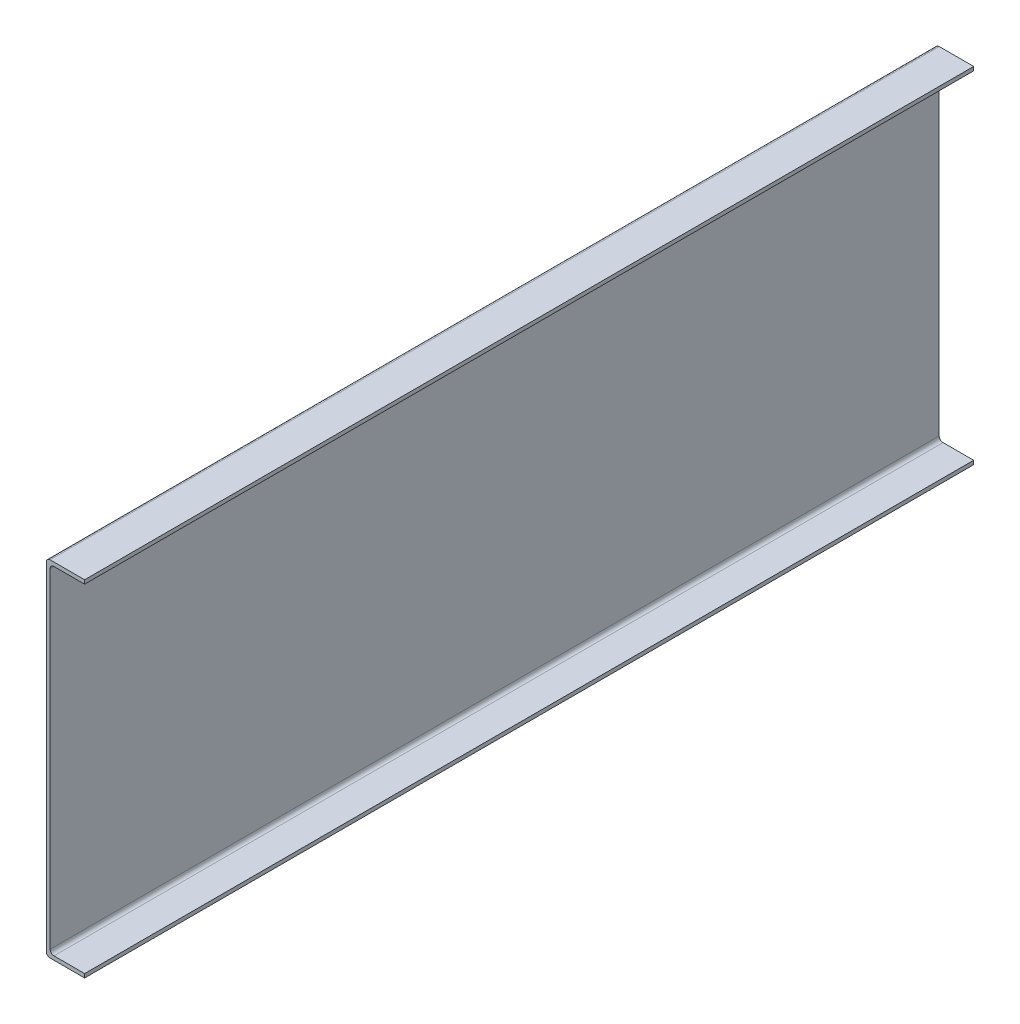
ISO-10303-21;
HEADER;
FILE_DESCRIPTION(('STEP AP214'),'2;1');
FILE_NAME('part.step','',(''),(''),'','','');
FILE_SCHEMA(('AUTOMOTIVE_DESIGN { 1 0 10303 214 1 1 1 1 }'));
ENDSEC;
DATA;
#1=APPLICATION_CONTEXT('core data for automotive mechanical design processes');
#2=APPLICATION_PROTOCOL_DEFINITION('international standard','automotive_design',2000,#1);
#3=PRODUCT_CONTEXT('',#1,'mechanical');
#4=PRODUCT('Part','Part','',(#3));
#5=PRODUCT_RELATED_PRODUCT_CATEGORY('part','',(#4));
#6=PRODUCT_DEFINITION_FORMATION('','',#4);
#7=PRODUCT_DEFINITION_CONTEXT('part definition',#1,'design');
#8=PRODUCT_DEFINITION('design','',#6,#7);
#9=PRODUCT_DEFINITION_SHAPE('','',#8);
#10=(LENGTH_UNIT() NAMED_UNIT(*) SI_UNIT(.MILLI.,.METRE.));
#11=(NAMED_UNIT(*) PLANE_ANGLE_UNIT() SI_UNIT($,.RADIAN.));
#12=(NAMED_UNIT(*) SI_UNIT($,.STERADIAN.) SOLID_ANGLE_UNIT());
#13=UNCERTAINTY_MEASURE_WITH_UNIT(LENGTH_MEASURE(1.E-05),#10,'distance_accuracy_value','');
#14=(GEOMETRIC_REPRESENTATION_CONTEXT(3) GLOBAL_UNCERTAINTY_ASSIGNED_CONTEXT((#13)) GLOBAL_UNIT_ASSIGNED_CONTEXT((#10,
#11,#12)) REPRESENTATION_CONTEXT('',''));
#15=CARTESIAN_POINT('',(0.,0.,0.));
#16=DIRECTION('',(0.,0.,1.));
#17=DIRECTION('',(1.,0.,0.));
#18=AXIS2_PLACEMENT_3D('',#15,#16,#17);
#19=CARTESIAN_POINT('',(0.,45.,232.));
#20=DIRECTION('',(0.,-1.,0.));
#21=DIRECTION('',(0.,0.,-1.));
#22=AXIS2_PLACEMENT_3D('',#19,#20,#21);
#23=PLANE('',#22);
#24=DIRECTION('',(-1.,0.,0.));
#25=VECTOR('',#24,1.);
#26=CARTESIAN_POINT('',(0.,45.,0.));
#27=LINE('',#26,#25);
#28=CARTESIAN_POINT('',(10.,45.,0.));
#29=VERTEX_POINT('',#28);
#30=CARTESIAN_POINT('',(0.999999999999984,45.,0.));
#31=VERTEX_POINT('',#30);
#32=EDGE_CURVE('E175',#29,#31,#27,.T.);
#33=ORIENTED_EDGE('',*,*,#32,.T.);
#34=DIRECTION('',(0.,0.,-1.));
#35=VECTOR('',#34,1.);
#36=CARTESIAN_POINT('',(0.999999999999984,45.,232.));
#37=LINE('',#36,#35);
#38=CARTESIAN_POINT('',(0.999999999999984,45.,232.));
#39=VERTEX_POINT('',#38);
#40=EDGE_CURVE('E231',#31,#39,#37,.F.);
#41=ORIENTED_EDGE('',*,*,#40,.T.);
#42=DIRECTION('',(-1.,0.,0.));
#43=VECTOR('',#42,1.);
#44=CARTESIAN_POINT('',(0.,45.,232.));
#45=LINE('',#44,#43);
#46=CARTESIAN_POINT('',(10.,45.,232.));
#47=VERTEX_POINT('',#46);
#48=EDGE_CURVE('E201',#47,#39,#45,.T.);
#49=ORIENTED_EDGE('',*,*,#48,.F.);
#50=DIRECTION('',(0.,0.,-1.));
#51=VECTOR('',#50,1.);
#52=CARTESIAN_POINT('',(10.,45.,232.));
#53=LINE('',#52,#51);
#54=EDGE_CURVE('E174',#47,#29,#53,.T.);
#55=ORIENTED_EDGE('',*,*,#54,.T.);
#56=EDGE_LOOP('',(#33,#41,#49,#55));
#57=FACE_BOUND('',#56,.T.);
#58=ADVANCED_FACE('F38',(#57),#23,.F.);
#59=CARTESIAN_POINT('',(0.,-45.,232.));
#60=DIRECTION('',(1.,0.,0.));
#61=DIRECTION('',(0.,1.,0.));
#62=AXIS2_PLACEMENT_3D('',#59,#60,#61);
#63=PLANE('',#62);
#64=DIRECTION('',(0.,-1.,0.));
#65=VECTOR('',#64,1.);
#66=CARTESIAN_POINT('',(0.,-45.,0.));
#67=LINE('',#66,#65);
#68=CARTESIAN_POINT('',(0.,44.,0.));
#69=VERTEX_POINT('',#68);
#70=CARTESIAN_POINT('',(0.,-44.,0.));
#71=VERTEX_POINT('',#70);
#72=EDGE_CURVE('E179',#69,#71,#67,.T.);
#73=ORIENTED_EDGE('',*,*,#72,.T.);
#74=DIRECTION('',(0.,0.,-1.));
#75=VECTOR('',#74,1.);
#76=CARTESIAN_POINT('',(0.,-44.,232.));
#77=LINE('',#76,#75);
#78=CARTESIAN_POINT('',(0.,-44.,232.));
#79=VERTEX_POINT('',#78);
#80=EDGE_CURVE('E223',#71,#79,#77,.F.);
#81=ORIENTED_EDGE('',*,*,#80,.T.);
#82=DIRECTION('',(0.,-1.,0.));
#83=VECTOR('',#82,1.);
#84=CARTESIAN_POINT('',(0.,-45.,232.));
#85=LINE('',#84,#83);
#86=CARTESIAN_POINT('',(0.,44.,232.));
#87=VERTEX_POINT('',#86);
#88=EDGE_CURVE('E141',#87,#79,#85,.T.);
#89=ORIENTED_EDGE('',*,*,#88,.F.);
#90=DIRECTION('',(0.,0.,-1.));
#91=VECTOR('',#90,1.);
#92=CARTESIAN_POINT('',(0.,44.,232.));
#93=LINE('',#92,#91);
#94=EDGE_CURVE('E219',#87,#69,#93,.T.);
#95=ORIENTED_EDGE('',*,*,#94,.T.);
#96=EDGE_LOOP('',(#73,#81,#89,#95));
#97=FACE_BOUND('',#96,.T.);
#98=ADVANCED_FACE('F294',(#97),#63,.F.);
#99=CARTESIAN_POINT('',(10.,-45.,232.));
#100=DIRECTION('',(0.,1.,0.));
#101=DIRECTION('',(0.,0.,1.));
#102=AXIS2_PLACEMENT_3D('',#99,#100,#101);
#103=PLANE('',#102);
#104=DIRECTION('',(1.,0.,0.));
#105=VECTOR('',#104,1.);
#106=CARTESIAN_POINT('',(10.,-45.,232.));
#107=LINE('',#106,#105);
#108=CARTESIAN_POINT('',(0.999999999999999,-45.,232.));
#109=VERTEX_POINT('',#108);
#110=CARTESIAN_POINT('',(10.,-45.,232.));
#111=VERTEX_POINT('',#110);
#112=EDGE_CURVE('E127',#109,#111,#107,.T.);
#113=ORIENTED_EDGE('',*,*,#112,.F.);
#114=DIRECTION('',(0.,0.,-1.));
#115=VECTOR('',#114,1.);
#116=CARTESIAN_POINT('',(0.999999999999999,-45.,232.));
#117=LINE('',#116,#115);
#118=CARTESIAN_POINT('',(0.999999999999999,-45.,0.));
#119=VERTEX_POINT('',#118);
#120=EDGE_CURVE('E151',#109,#119,#117,.T.);
#121=ORIENTED_EDGE('',*,*,#120,.T.);
#122=DIRECTION('',(1.,0.,0.));
#123=VECTOR('',#122,1.);
#124=CARTESIAN_POINT('',(10.,-45.,0.));
#125=LINE('',#124,#123);
#126=CARTESIAN_POINT('',(10.,-45.,0.));
#127=VERTEX_POINT('',#126);
#128=EDGE_CURVE('E147',#119,#127,#125,.T.);
#129=ORIENTED_EDGE('',*,*,#128,.T.);
#130=DIRECTION('',(0.,0.,-1.));
#131=VECTOR('',#130,1.);
#132=CARTESIAN_POINT('',(10.,-45.,232.));
#133=LINE('',#132,#131);
#134=EDGE_CURVE('E144',#111,#127,#133,.T.);
#135=ORIENTED_EDGE('',*,*,#134,.F.);
#136=EDGE_LOOP('',(#113,#121,#129,#135));
#137=FACE_BOUND('',#136,.T.);
#138=ADVANCED_FACE('F145',(#137),#103,.F.);
#139=CARTESIAN_POINT('',(10.,-44.,232.));
#140=DIRECTION('',(-1.,0.,0.));
#141=DIRECTION('',(0.,-1.,0.));
#142=AXIS2_PLACEMENT_3D('',#139,#140,#141);
#143=PLANE('',#142);
#144=DIRECTION('',(0.,1.,0.));
#145=VECTOR('',#144,1.);
#146=CARTESIAN_POINT('',(10.,-44.,0.));
#147=LINE('',#146,#145);
#148=CARTESIAN_POINT('',(10.,-44.,0.));
#149=VERTEX_POINT('',#148);
#150=EDGE_CURVE('E185',#127,#149,#147,.T.);
#151=ORIENTED_EDGE('',*,*,#150,.T.);
#152=DIRECTION('',(0.,0.,-1.));
#153=VECTOR('',#152,1.);
#154=CARTESIAN_POINT('',(10.,-44.,232.));
#155=LINE('',#154,#153);
#156=CARTESIAN_POINT('',(10.,-44.,232.));
#157=VERTEX_POINT('',#156);
#158=EDGE_CURVE('E152',#157,#149,#155,.T.);
#159=ORIENTED_EDGE('',*,*,#158,.F.);
#160=DIRECTION('',(0.,1.,0.));
#161=VECTOR('',#160,1.);
#162=CARTESIAN_POINT('',(10.,-44.,232.));
#163=LINE('',#162,#161);
#164=EDGE_CURVE('E133',#111,#157,#163,.T.);
#165=ORIENTED_EDGE('',*,*,#164,.F.);
#166=ORIENTED_EDGE('',*,*,#134,.T.);
#167=EDGE_LOOP('',(#151,#159,#165,#166));
#168=FACE_BOUND('',#167,.T.);
#169=ADVANCED_FACE('F154',(#168),#143,.F.);
#170=CARTESIAN_POINT('',(1.00000000000001,-44.,232.));
#171=DIRECTION('',(0.,-1.,0.));
#172=DIRECTION('',(0.,0.,-1.));
#173=AXIS2_PLACEMENT_3D('',#170,#171,#172);
#174=PLANE('',#173);
#175=DIRECTION('',(-1.,0.,0.));
#176=VECTOR('',#175,1.);
#177=CARTESIAN_POINT('',(1.00000000000001,-44.,0.));
#178=LINE('',#177,#176);
#179=CARTESIAN_POINT('',(2.00000000000001,-44.,0.));
#180=VERTEX_POINT('',#179);
#181=EDGE_CURVE('E188',#149,#180,#178,.T.);
#182=ORIENTED_EDGE('',*,*,#181,.T.);
#183=DIRECTION('',(0.,0.,-1.));
#184=VECTOR('',#183,1.);
#185=CARTESIAN_POINT('',(2.00000000000001,-44.,232.));
#186=LINE('',#185,#184);
#187=CARTESIAN_POINT('',(2.00000000000001,-44.,232.));
#188=VERTEX_POINT('',#187);
#189=EDGE_CURVE('E244',#180,#188,#186,.F.);
#190=ORIENTED_EDGE('',*,*,#189,.T.);
#191=DIRECTION('',(-1.,0.,0.));
#192=VECTOR('',#191,1.);
#193=CARTESIAN_POINT('',(1.00000000000001,-44.,232.));
#194=LINE('',#193,#192);
#195=EDGE_CURVE('E158',#157,#188,#194,.T.);
#196=ORIENTED_EDGE('',*,*,#195,.F.);
#197=ORIENTED_EDGE('',*,*,#158,.T.);
#198=EDGE_LOOP('',(#182,#190,#196,#197));
#199=FACE_BOUND('',#198,.T.);
#200=ADVANCED_FACE('F261',(#199),#174,.F.);
#201=CARTESIAN_POINT('',(0.999999999999997,44.,232.));
#202=DIRECTION('',(-1.,0.,0.));
#203=DIRECTION('',(0.,-1.,0.));
#204=AXIS2_PLACEMENT_3D('',#201,#202,#203);
#205=PLANE('',#204);
#206=DIRECTION('',(0.,1.,0.));
#207=VECTOR('',#206,1.);
#208=CARTESIAN_POINT('',(0.999999999999997,44.,0.));
#209=LINE('',#208,#207);
#210=CARTESIAN_POINT('',(1.00000000000001,-43.,0.));
#211=VERTEX_POINT('',#210);
#212=CARTESIAN_POINT('',(0.999999999999998,43.,0.));
#213=VERTEX_POINT('',#212);
#214=EDGE_CURVE('E192',#211,#213,#209,.T.);
#215=ORIENTED_EDGE('',*,*,#214,.T.);
#216=DIRECTION('',(0.,0.,-1.));
#217=VECTOR('',#216,1.);
#218=CARTESIAN_POINT('',(0.999999999999998,43.,232.));
#219=LINE('',#218,#217);
#220=CARTESIAN_POINT('',(0.999999999999998,43.,232.));
#221=VERTEX_POINT('',#220);
#222=EDGE_CURVE('E62',#213,#221,#219,.F.);
#223=ORIENTED_EDGE('',*,*,#222,.T.);
#224=DIRECTION('',(0.,1.,0.));
#225=VECTOR('',#224,1.);
#226=CARTESIAN_POINT('',(0.999999999999997,44.,232.));
#227=LINE('',#226,#225);
#228=CARTESIAN_POINT('',(1.00000000000001,-43.,232.));
#229=VERTEX_POINT('',#228);
#230=EDGE_CURVE('E162',#229,#221,#227,.T.);
#231=ORIENTED_EDGE('',*,*,#230,.F.);
#232=DIRECTION('',(0.,0.,-1.));
#233=VECTOR('',#232,1.);
#234=CARTESIAN_POINT('',(1.00000000000001,-43.,0.));
#235=LINE('',#234,#233);
#236=EDGE_CURVE('E238',#229,#211,#235,.T.);
#237=ORIENTED_EDGE('',*,*,#236,.T.);
#238=EDGE_LOOP('',(#215,#223,#231,#237));
#239=FACE_BOUND('',#238,.T.);
#240=ADVANCED_FACE('F263',(#239),#205,.F.);
#241=CARTESIAN_POINT('',(10.,44.,232.));
#242=DIRECTION('',(0.,1.,0.));
#243=DIRECTION('',(0.,0.,1.));
#244=AXIS2_PLACEMENT_3D('',#241,#242,#243);
#245=PLANE('',#244);
#246=DIRECTION('',(1.,0.,0.));
#247=VECTOR('',#246,1.);
#248=CARTESIAN_POINT('',(10.,44.,232.));
#249=LINE('',#248,#247);
#250=CARTESIAN_POINT('',(2.,44.,232.));
#251=VERTEX_POINT('',#250);
#252=CARTESIAN_POINT('',(10.,44.,232.));
#253=VERTEX_POINT('',#252);
#254=EDGE_CURVE('E168',#251,#253,#249,.T.);
#255=ORIENTED_EDGE('',*,*,#254,.F.);
#256=DIRECTION('',(0.,0.,-1.));
#257=VECTOR('',#256,1.);
#258=CARTESIAN_POINT('',(2.,44.,0.));
#259=LINE('',#258,#257);
#260=CARTESIAN_POINT('',(2.,44.,0.));
#261=VERTEX_POINT('',#260);
#262=EDGE_CURVE('E234',#251,#261,#259,.T.);
#263=ORIENTED_EDGE('',*,*,#262,.T.);
#264=DIRECTION('',(1.,0.,0.));
#265=VECTOR('',#264,1.);
#266=CARTESIAN_POINT('',(10.,44.,0.));
#267=LINE('',#266,#265);
#268=CARTESIAN_POINT('',(10.,44.,0.));
#269=VERTEX_POINT('',#268);
#270=EDGE_CURVE('E195',#261,#269,#267,.T.);
#271=ORIENTED_EDGE('',*,*,#270,.T.);
#272=DIRECTION('',(0.,0.,-1.));
#273=VECTOR('',#272,1.);
#274=CARTESIAN_POINT('',(10.,44.,232.));
#275=LINE('',#274,#273);
#276=EDGE_CURVE('E205',#253,#269,#275,.T.);
#277=ORIENTED_EDGE('',*,*,#276,.F.);
#278=EDGE_LOOP('',(#255,#263,#271,#277));
#279=FACE_BOUND('',#278,.T.);
#280=ADVANCED_FACE('F269',(#279),#245,.F.);
#281=CARTESIAN_POINT('',(10.,45.,232.));
#282=DIRECTION('',(-1.,0.,0.));
#283=DIRECTION('',(0.,0.,1.));
#284=AXIS2_PLACEMENT_3D('',#281,#282,#283);
#285=PLANE('',#284);
#286=DIRECTION('',(0.,1.,0.));
#287=VECTOR('',#286,1.);
#288=CARTESIAN_POINT('',(10.,45.,0.));
#289=LINE('',#288,#287);
#290=EDGE_CURVE('E198',#269,#29,#289,.T.);
#291=ORIENTED_EDGE('',*,*,#290,.T.);
#292=ORIENTED_EDGE('',*,*,#54,.F.);
#293=DIRECTION('',(0.,1.,0.));
#294=VECTOR('',#293,1.);
#295=CARTESIAN_POINT('',(10.,45.,232.));
#296=LINE('',#295,#294);
#297=EDGE_CURVE('E171',#253,#47,#296,.T.);
#298=ORIENTED_EDGE('',*,*,#297,.F.);
#299=ORIENTED_EDGE('',*,*,#276,.T.);
#300=EDGE_LOOP('',(#291,#292,#298,#299));
#301=FACE_BOUND('',#300,.T.);
#302=ADVANCED_FACE('F275',(#301),#285,.F.);
#303=CARTESIAN_POINT('',(0.,0.,232.));
#304=DIRECTION('',(0.,0.,-1.));
#305=DIRECTION('',(-1.,0.,0.));
#306=AXIS2_PLACEMENT_3D('',#303,#304,#305);
#307=PLANE('',#306);
#308=ORIENTED_EDGE('',*,*,#88,.T.);
#309=CARTESIAN_POINT('',(0.999999999999999,-44.,232.));
#310=DIRECTION('',(0.,0.,-1.));
#311=DIRECTION('',(-1.,0.,0.));
#312=AXIS2_PLACEMENT_3D('',#309,#310,#311);
#313=CIRCLE('',#312,1.);
#314=EDGE_CURVE('E136',#79,#109,#313,.F.);
#315=ORIENTED_EDGE('',*,*,#314,.T.);
#316=ORIENTED_EDGE('',*,*,#112,.T.);
#317=ORIENTED_EDGE('',*,*,#164,.T.);
#318=ORIENTED_EDGE('',*,*,#195,.T.);
#319=CARTESIAN_POINT('',(2.00000000000001,-43.,232.));
#320=DIRECTION('',(0.,0.,-1.));
#321=DIRECTION('',(-1.,0.,0.));
#322=AXIS2_PLACEMENT_3D('',#319,#320,#321);
#323=CIRCLE('',#322,1.);
#324=EDGE_CURVE('E11',#188,#229,#323,.T.);
#325=ORIENTED_EDGE('',*,*,#324,.T.);
#326=ORIENTED_EDGE('',*,*,#230,.T.);
#327=CARTESIAN_POINT('',(2.,43.,232.));
#328=DIRECTION('',(0.,0.,-1.));
#329=DIRECTION('',(-1.,0.,0.));
#330=AXIS2_PLACEMENT_3D('',#327,#328,#329);
#331=CIRCLE('',#330,1.);
#332=EDGE_CURVE('E54',#221,#251,#331,.T.);
#333=ORIENTED_EDGE('',*,*,#332,.T.);
#334=ORIENTED_EDGE('',*,*,#254,.T.);
#335=ORIENTED_EDGE('',*,*,#297,.T.);
#336=ORIENTED_EDGE('',*,*,#48,.T.);
#337=CARTESIAN_POINT('',(0.999999999999984,44.,232.));
#338=DIRECTION('',(0.,0.,-1.));
#339=DIRECTION('',(-1.,0.,0.));
#340=AXIS2_PLACEMENT_3D('',#337,#338,#339);
#341=CIRCLE('',#340,1.);
#342=EDGE_CURVE('E226',#39,#87,#341,.F.);
#343=ORIENTED_EDGE('',*,*,#342,.T.);
#344=EDGE_LOOP('',(#308,#315,#316,#317,#318,#325,#326,#333,#334,#335,#336,#343));
#345=FACE_BOUND('',#344,.T.);
#346=ADVANCED_FACE('F130',(#345),#307,.F.);
#347=CARTESIAN_POINT('',(0.,0.,0.));
#348=DIRECTION('',(0.,0.,-1.));
#349=DIRECTION('',(-1.,0.,0.));
#350=AXIS2_PLACEMENT_3D('',#347,#348,#349);
#351=PLANE('',#350);
#352=ORIENTED_EDGE('',*,*,#128,.F.);
#353=CARTESIAN_POINT('',(0.999999999999999,-44.,0.));
#354=DIRECTION('',(0.,0.,-1.));
#355=DIRECTION('',(-1.,0.,0.));
#356=AXIS2_PLACEMENT_3D('',#353,#354,#355);
#357=CIRCLE('',#356,1.);
#358=EDGE_CURVE('E216',#119,#71,#357,.T.);
#359=ORIENTED_EDGE('',*,*,#358,.T.);
#360=ORIENTED_EDGE('',*,*,#72,.F.);
#361=CARTESIAN_POINT('',(0.999999999999984,44.,0.));
#362=DIRECTION('',(0.,0.,-1.));
#363=DIRECTION('',(-1.,0.,0.));
#364=AXIS2_PLACEMENT_3D('',#361,#362,#363);
#365=CIRCLE('',#364,1.);
#366=EDGE_CURVE('E213',#69,#31,#365,.T.);
#367=ORIENTED_EDGE('',*,*,#366,.T.);
#368=ORIENTED_EDGE('',*,*,#32,.F.);
#369=ORIENTED_EDGE('',*,*,#290,.F.);
#370=ORIENTED_EDGE('',*,*,#270,.F.);
#371=CARTESIAN_POINT('',(2.,43.,0.));
#372=DIRECTION('',(0.,0.,-1.));
#373=DIRECTION('',(-1.,0.,0.));
#374=AXIS2_PLACEMENT_3D('',#371,#372,#373);
#375=CIRCLE('',#374,1.);
#376=EDGE_CURVE('E247',#261,#213,#375,.F.);
#377=ORIENTED_EDGE('',*,*,#376,.T.);
#378=ORIENTED_EDGE('',*,*,#214,.F.);
#379=CARTESIAN_POINT('',(2.00000000000001,-43.,0.));
#380=DIRECTION('',(0.,0.,-1.));
#381=DIRECTION('',(-1.,0.,0.));
#382=AXIS2_PLACEMENT_3D('',#379,#380,#381);
#383=CIRCLE('',#382,1.);
#384=EDGE_CURVE('E47',#211,#180,#383,.F.);
#385=ORIENTED_EDGE('',*,*,#384,.T.);
#386=ORIENTED_EDGE('',*,*,#181,.F.);
#387=ORIENTED_EDGE('',*,*,#150,.F.);
#388=EDGE_LOOP('',(#352,#359,#360,#367,#368,#369,#370,#377,#378,#385,#386,#387));
#389=FACE_BOUND('',#388,.T.);
#390=ADVANCED_FACE('F256',(#389),#351,.T.);
#391=CARTESIAN_POINT('',(0.999999999999999,-44.,232.));
#392=DIRECTION('',(0.,0.,-1.));
#393=DIRECTION('',(-1.,0.,0.));
#394=AXIS2_PLACEMENT_3D('',#391,#392,#393);
#395=CYLINDRICAL_SURFACE('',#394,1.);
#396=ORIENTED_EDGE('',*,*,#314,.F.);
#397=ORIENTED_EDGE('',*,*,#80,.F.);
#398=ORIENTED_EDGE('',*,*,#358,.F.);
#399=ORIENTED_EDGE('',*,*,#120,.F.);
#400=EDGE_LOOP('',(#396,#397,#398,#399));
#401=FACE_BOUND('',#400,.T.);
#402=ADVANCED_FACE('F292',(#401),#395,.T.);
#403=CARTESIAN_POINT('',(0.999999999999984,44.,232.));
#404=DIRECTION('',(0.,0.,-1.));
#405=DIRECTION('',(-1.,0.,0.));
#406=AXIS2_PLACEMENT_3D('',#403,#404,#405);
#407=CYLINDRICAL_SURFACE('',#406,1.);
#408=ORIENTED_EDGE('',*,*,#342,.F.);
#409=ORIENTED_EDGE('',*,*,#40,.F.);
#410=ORIENTED_EDGE('',*,*,#366,.F.);
#411=ORIENTED_EDGE('',*,*,#94,.F.);
#412=EDGE_LOOP('',(#408,#409,#410,#411));
#413=FACE_BOUND('',#412,.T.);
#414=ADVANCED_FACE('F296',(#413),#407,.T.);
#415=CARTESIAN_POINT('',(2.,43.,232.));
#416=DIRECTION('',(0.,0.,1.));
#417=DIRECTION('',(1.,0.,0.));
#418=AXIS2_PLACEMENT_3D('',#415,#416,#417);
#419=CYLINDRICAL_SURFACE('',#418,1.);
#420=ORIENTED_EDGE('',*,*,#332,.F.);
#421=ORIENTED_EDGE('',*,*,#222,.F.);
#422=ORIENTED_EDGE('',*,*,#376,.F.);
#423=ORIENTED_EDGE('',*,*,#262,.F.);
#424=EDGE_LOOP('',(#420,#421,#422,#423));
#425=FACE_BOUND('',#424,.T.);
#426=ADVANCED_FACE('F265',(#425),#419,.F.);
#427=CARTESIAN_POINT('',(2.00000000000001,-43.,232.));
#428=DIRECTION('',(0.,0.,1.));
#429=DIRECTION('',(1.,0.,0.));
#430=AXIS2_PLACEMENT_3D('',#427,#428,#429);
#431=CYLINDRICAL_SURFACE('',#430,1.);
#432=ORIENTED_EDGE('',*,*,#324,.F.);
#433=ORIENTED_EDGE('',*,*,#189,.F.);
#434=ORIENTED_EDGE('',*,*,#384,.F.);
#435=ORIENTED_EDGE('',*,*,#236,.F.);
#436=EDGE_LOOP('',(#432,#433,#434,#435));
#437=FACE_BOUND('',#436,.T.);
#438=ADVANCED_FACE('F40',(#437),#431,.F.);
#439=CLOSED_SHELL('',(#58,#98,#138,#169,#200,#240,#280,#302,#346,#390,#402,#414,#426,#438));
#440=MANIFOLD_SOLID_BREP('B2',#439);
#441=ADVANCED_BREP_SHAPE_REPRESENTATION('',(#18,#440),#14);
#442=SHAPE_DEFINITION_REPRESENTATION(#9,#441);
ENDSEC;
END-ISO-10303-21;
